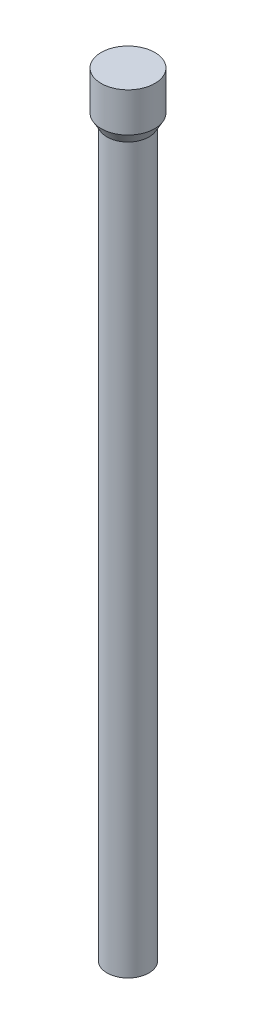
ISO-10303-21;
HEADER;
FILE_DESCRIPTION(('STEP AP214'),'2;1');
FILE_NAME('part.step','',(''),(''),'','','');
FILE_SCHEMA(('AUTOMOTIVE_DESIGN { 1 0 10303 214 1 1 1 1 }'));
ENDSEC;
DATA;
#1=APPLICATION_CONTEXT('core data for automotive mechanical design processes');
#2=APPLICATION_PROTOCOL_DEFINITION('international standard','automotive_design',2000,#1);
#3=PRODUCT_CONTEXT('',#1,'mechanical');
#4=PRODUCT('Part','Part','',(#3));
#5=PRODUCT_RELATED_PRODUCT_CATEGORY('part','',(#4));
#6=PRODUCT_DEFINITION_FORMATION('','',#4);
#7=PRODUCT_DEFINITION_CONTEXT('part definition',#1,'design');
#8=PRODUCT_DEFINITION('design','',#6,#7);
#9=PRODUCT_DEFINITION_SHAPE('','',#8);
#10=(LENGTH_UNIT() NAMED_UNIT(*) SI_UNIT(.MILLI.,.METRE.));
#11=(NAMED_UNIT(*) PLANE_ANGLE_UNIT() SI_UNIT($,.RADIAN.));
#12=(NAMED_UNIT(*) SI_UNIT($,.STERADIAN.) SOLID_ANGLE_UNIT());
#13=UNCERTAINTY_MEASURE_WITH_UNIT(LENGTH_MEASURE(1.E-05),#10,'distance_accuracy_value','');
#14=(GEOMETRIC_REPRESENTATION_CONTEXT(3) GLOBAL_UNCERTAINTY_ASSIGNED_CONTEXT((#13)) GLOBAL_UNIT_ASSIGNED_CONTEXT((#10,
#11,#12)) REPRESENTATION_CONTEXT('',''));
#15=CARTESIAN_POINT('',(0.,0.,0.));
#16=DIRECTION('',(0.,0.,1.));
#17=DIRECTION('',(1.,0.,0.));
#18=AXIS2_PLACEMENT_3D('',#15,#16,#17);
#19=CARTESIAN_POINT('',(0.,2.,0.));
#20=DIRECTION('',(0.,-1.,0.));
#21=DIRECTION('',(0.,0.,-1.));
#22=AXIS2_PLACEMENT_3D('',#19,#20,#21);
#23=CYLINDRICAL_SURFACE('',#22,2.5);
#24=CARTESIAN_POINT('',(0.,-1.64544826719048,0.));
#25=DIRECTION('',(0.,1.,0.));
#26=DIRECTION('',(0.,0.,1.));
#27=AXIS2_PLACEMENT_3D('',#24,#25,#26);
#28=CIRCLE('',#27,2.5);
#29=CARTESIAN_POINT('',(0.,-1.64544826719048,2.5));
#30=VERTEX_POINT('',#29);
#31=EDGE_CURVE('E10',#30,#30,#28,.T.);
#32=ORIENTED_EDGE('',*,*,#31,.T.);
#33=EDGE_LOOP('',(#32));
#34=FACE_BOUND('',#33,.T.);
#35=CARTESIAN_POINT('',(0.,2.,0.));
#36=DIRECTION('',(0.,1.,0.));
#37=DIRECTION('',(0.,0.,1.));
#38=AXIS2_PLACEMENT_3D('',#35,#36,#37);
#39=CIRCLE('',#38,2.5);
#40=CARTESIAN_POINT('',(0.,2.,2.5));
#41=VERTEX_POINT('',#40);
#42=EDGE_CURVE('E51',#41,#41,#39,.T.);
#43=ORIENTED_EDGE('',*,*,#42,.F.);
#44=EDGE_LOOP('',(#43));
#45=FACE_BOUND('',#44,.T.);
#46=ADVANCED_FACE('F39',(#34,#45),#23,.T.);
#47=CARTESIAN_POINT('',(0.,2.,0.));
#48=DIRECTION('',(0.,1.,0.));
#49=DIRECTION('',(0.,0.,1.));
#50=AXIS2_PLACEMENT_3D('',#47,#48,#49);
#51=PLANE('',#50);
#52=ORIENTED_EDGE('',*,*,#42,.T.);
#53=EDGE_LOOP('',(#52));
#54=FACE_BOUND('',#53,.T.);
#55=ADVANCED_FACE('F65',(#54),#51,.T.);
#56=CARTESIAN_POINT('',(0.,-70.,0.));
#57=DIRECTION('',(0.,1.,0.));
#58=DIRECTION('',(0.,0.,1.));
#59=AXIS2_PLACEMENT_3D('',#56,#57,#58);
#60=CYLINDRICAL_SURFACE('',#59,1.95);
#61=CARTESIAN_POINT('',(0.,-2.59807621135337,0.));
#62=DIRECTION('',(0.,1.,0.));
#63=DIRECTION('',(0.,0.,1.));
#64=AXIS2_PLACEMENT_3D('',#61,#62,#63);
#65=CIRCLE('',#64,1.95);
#66=CARTESIAN_POINT('',(0.,-2.59807621135337,1.95));
#67=VERTEX_POINT('',#66);
#68=EDGE_CURVE('E47',#67,#67,#65,.F.);
#69=ORIENTED_EDGE('',*,*,#68,.T.);
#70=EDGE_LOOP('',(#69));
#71=FACE_BOUND('',#70,.T.);
#72=CARTESIAN_POINT('',(0.,-70.,0.));
#73=DIRECTION('',(0.,-1.,0.));
#74=DIRECTION('',(0.,0.,-1.));
#75=AXIS2_PLACEMENT_3D('',#72,#73,#74);
#76=CIRCLE('',#75,1.95);
#77=CARTESIAN_POINT('',(0.,-70.,-1.95));
#78=VERTEX_POINT('',#77);
#79=EDGE_CURVE('E55',#78,#78,#76,.T.);
#80=ORIENTED_EDGE('',*,*,#79,.F.);
#81=EDGE_LOOP('',(#80));
#82=FACE_BOUND('',#81,.T.);
#83=ADVANCED_FACE('F63',(#71,#82),#60,.T.);
#84=CARTESIAN_POINT('',(0.,-70.,0.));
#85=DIRECTION('',(0.,-1.,0.));
#86=DIRECTION('',(0.,0.,-1.));
#87=AXIS2_PLACEMENT_3D('',#84,#85,#86);
#88=PLANE('',#87);
#89=ORIENTED_EDGE('',*,*,#79,.T.);
#90=EDGE_LOOP('',(#89));
#91=FACE_BOUND('',#90,.T.);
#92=ADVANCED_FACE('F61',(#91),#88,.T.);
#93=CARTESIAN_POINT('',(0.,-2.59807621135337,0.));
#94=DIRECTION('',(0.,1.,0.));
#95=DIRECTION('',(0.,0.,1.));
#96=AXIS2_PLACEMENT_3D('',#93,#94,#95);
#97=CONICAL_SURFACE('',#96,1.95,0.523598775598295);
#98=ORIENTED_EDGE('',*,*,#31,.F.);
#99=EDGE_LOOP('',(#98));
#100=FACE_BOUND('',#99,.T.);
#101=ORIENTED_EDGE('',*,*,#68,.F.);
#102=EDGE_LOOP('',(#101));
#103=FACE_BOUND('',#102,.T.);
#104=ADVANCED_FACE('F42',(#100,#103),#97,.T.);
#105=CLOSED_SHELL('',(#46,#55,#83,#92,#104));
#106=MANIFOLD_SOLID_BREP('B2',#105);
#107=ADVANCED_BREP_SHAPE_REPRESENTATION('',(#18,#106),#14);
#108=SHAPE_DEFINITION_REPRESENTATION(#9,#107);
ENDSEC;
END-ISO-10303-21;
